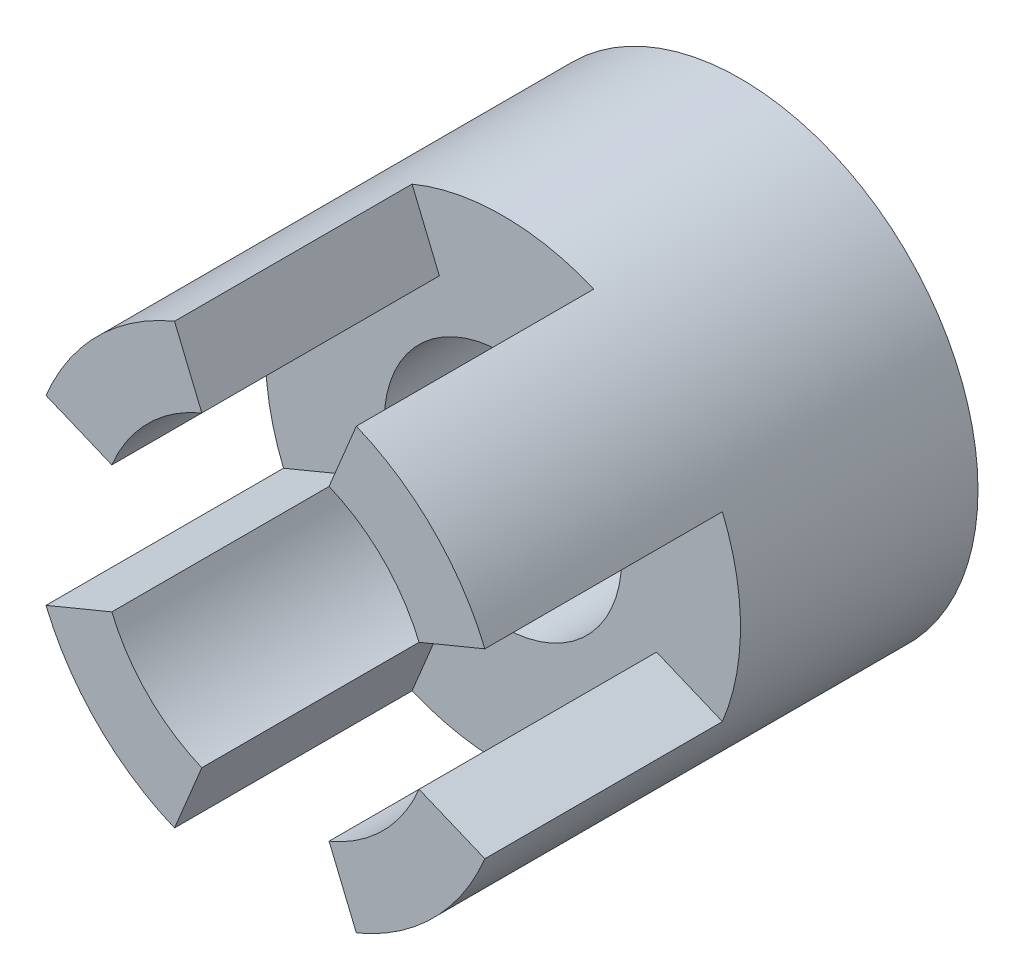
ISO-10303-21;
HEADER;
FILE_DESCRIPTION(('STEP AP214'),'2;1');
FILE_NAME('part.step','',(''),(''),'','','');
FILE_SCHEMA(('AUTOMOTIVE_DESIGN { 1 0 10303 214 1 1 1 1 }'));
ENDSEC;
DATA;
#1=APPLICATION_CONTEXT('core data for automotive mechanical design processes');
#2=APPLICATION_PROTOCOL_DEFINITION('international standard','automotive_design',2000,#1);
#3=PRODUCT_CONTEXT('',#1,'mechanical');
#4=PRODUCT('Part','Part','',(#3));
#5=PRODUCT_RELATED_PRODUCT_CATEGORY('part','',(#4));
#6=PRODUCT_DEFINITION_FORMATION('','',#4);
#7=PRODUCT_DEFINITION_CONTEXT('part definition',#1,'design');
#8=PRODUCT_DEFINITION('design','',#6,#7);
#9=PRODUCT_DEFINITION_SHAPE('','',#8);
#10=(LENGTH_UNIT() NAMED_UNIT(*) SI_UNIT(.MILLI.,.METRE.));
#11=(NAMED_UNIT(*) PLANE_ANGLE_UNIT() SI_UNIT($,.RADIAN.));
#12=(NAMED_UNIT(*) SI_UNIT($,.STERADIAN.) SOLID_ANGLE_UNIT());
#13=UNCERTAINTY_MEASURE_WITH_UNIT(LENGTH_MEASURE(1.E-05),#10,'distance_accuracy_value','');
#14=(GEOMETRIC_REPRESENTATION_CONTEXT(3) GLOBAL_UNCERTAINTY_ASSIGNED_CONTEXT((#13)) GLOBAL_UNIT_ASSIGNED_CONTEXT((#10,
#11,#12)) REPRESENTATION_CONTEXT('',''));
#15=CARTESIAN_POINT('',(0.,0.,0.));
#16=DIRECTION('',(0.,0.,1.));
#17=DIRECTION('',(1.,0.,0.));
#18=AXIS2_PLACEMENT_3D('',#15,#16,#17);
#19=CARTESIAN_POINT('',(0.,0.,20.));
#20=DIRECTION('',(0.,0.,1.));
#21=DIRECTION('',(1.,0.,0.));
#22=AXIS2_PLACEMENT_3D('',#19,#20,#21);
#23=PLANE('',#22);
#24=CARTESIAN_POINT('',(0.,0.,20.));
#25=DIRECTION('',(0.,0.,1.));
#26=DIRECTION('',(1.,0.,0.));
#27=AXIS2_PLACEMENT_3D('',#24,#25,#26);
#28=CIRCLE('',#27,7.);
#29=CARTESIAN_POINT('',(6.46715672757901,2.67878402655563,20.));
#30=VERTEX_POINT('',#29);
#31=CARTESIAN_POINT('',(2.67878402655563,6.46715672757901,20.));
#32=VERTEX_POINT('',#31);
#33=EDGE_CURVE('E142',#30,#32,#28,.T.);
#34=ORIENTED_EDGE('',*,*,#33,.F.);
#35=DIRECTION('',(-0.923879532511287,-0.38268343236509,0.));
#36=VECTOR('',#35,1.);
#37=CARTESIAN_POINT('',(0.,0.,20.));
#38=LINE('',#37,#36);
#39=CARTESIAN_POINT('',(9.23879532511287,3.82683432365091,20.));
#40=VERTEX_POINT('',#39);
#41=EDGE_CURVE('E173',#40,#30,#38,.T.);
#42=ORIENTED_EDGE('',*,*,#41,.F.);
#43=CARTESIAN_POINT('',(0.,0.,20.));
#44=DIRECTION('',(0.,0.,1.));
#45=DIRECTION('',(1.,0.,0.));
#46=AXIS2_PLACEMENT_3D('',#43,#44,#45);
#47=CIRCLE('',#46,10.);
#48=CARTESIAN_POINT('',(3.82683432365091,9.23879532511287,20.));
#49=VERTEX_POINT('',#48);
#50=EDGE_CURVE('E234',#40,#49,#47,.T.);
#51=ORIENTED_EDGE('',*,*,#50,.T.);
#52=DIRECTION('',(-0.382683432365091,-0.923879532511287,0.));
#53=VECTOR('',#52,1.);
#54=CARTESIAN_POINT('',(0.,0.,20.));
#55=LINE('',#54,#53);
#56=EDGE_CURVE('E154',#49,#32,#55,.T.);
#57=ORIENTED_EDGE('',*,*,#56,.T.);
#58=EDGE_LOOP('',(#34,#42,#51,#57));
#59=FACE_BOUND('',#58,.T.);
#60=ADVANCED_FACE('F37',(#59),#23,.T.);
#61=CARTESIAN_POINT('',(-2.67878402655563,6.46715672757901,20.));
#62=VERTEX_POINT('',#61);
#63=CARTESIAN_POINT('',(-6.46715672757901,2.67878402655563,20.));
#64=VERTEX_POINT('',#63);
#65=EDGE_CURVE('E318',#62,#64,#28,.T.);
#66=ORIENTED_EDGE('',*,*,#65,.F.);
#67=DIRECTION('',(0.38268343236509,-0.923879532511287,0.));
#68=VECTOR('',#67,1.);
#69=CARTESIAN_POINT('',(0.,0.,20.));
#70=LINE('',#69,#68);
#71=CARTESIAN_POINT('',(-3.8268343236509,9.23879532511287,20.));
#72=VERTEX_POINT('',#71);
#73=EDGE_CURVE('E150',#72,#62,#70,.T.);
#74=ORIENTED_EDGE('',*,*,#73,.F.);
#75=CARTESIAN_POINT('',(-9.23879532511287,3.8268343236509,20.));
#76=VERTEX_POINT('',#75);
#77=EDGE_CURVE('E236',#72,#76,#47,.T.);
#78=ORIENTED_EDGE('',*,*,#77,.T.);
#79=DIRECTION('',(0.923879532511287,-0.38268343236509,0.));
#80=VECTOR('',#79,1.);
#81=CARTESIAN_POINT('',(0.,0.,20.));
#82=LINE('',#81,#80);
#83=EDGE_CURVE('E102',#76,#64,#82,.T.);
#84=ORIENTED_EDGE('',*,*,#83,.T.);
#85=EDGE_LOOP('',(#66,#74,#78,#84));
#86=FACE_BOUND('',#85,.T.);
#87=ADVANCED_FACE('F258',(#86),#23,.T.);
#88=CARTESIAN_POINT('',(-6.46715672757901,-2.67878402655563,20.));
#89=VERTEX_POINT('',#88);
#90=CARTESIAN_POINT('',(-2.67878402655563,-6.46715672757901,20.));
#91=VERTEX_POINT('',#90);
#92=EDGE_CURVE('E352',#89,#91,#28,.T.);
#93=ORIENTED_EDGE('',*,*,#92,.F.);
#94=DIRECTION('',(0.923879532511287,0.38268343236509,0.));
#95=VECTOR('',#94,1.);
#96=CARTESIAN_POINT('',(0.,0.,20.));
#97=LINE('',#96,#95);
#98=CARTESIAN_POINT('',(-9.23879532511287,-3.8268343236509,20.));
#99=VERTEX_POINT('',#98);
#100=EDGE_CURVE('E218',#99,#89,#97,.T.);
#101=ORIENTED_EDGE('',*,*,#100,.F.);
#102=CARTESIAN_POINT('',(-3.82683432365091,-9.23879532511287,20.));
#103=VERTEX_POINT('',#102);
#104=EDGE_CURVE('E330',#99,#103,#47,.T.);
#105=ORIENTED_EDGE('',*,*,#104,.T.);
#106=DIRECTION('',(0.382683432365091,0.923879532511287,0.));
#107=VECTOR('',#106,1.);
#108=CARTESIAN_POINT('',(0.,0.,20.));
#109=LINE('',#108,#107);
#110=EDGE_CURVE('E200',#103,#91,#109,.T.);
#111=ORIENTED_EDGE('',*,*,#110,.T.);
#112=EDGE_LOOP('',(#93,#101,#105,#111));
#113=FACE_BOUND('',#112,.T.);
#114=ADVANCED_FACE('F254',(#113),#23,.T.);
#115=CARTESIAN_POINT('',(0.,0.,0.));
#116=DIRECTION('',(0.,0.,1.));
#117=DIRECTION('',(1.,0.,0.));
#118=AXIS2_PLACEMENT_3D('',#115,#116,#117);
#119=PLANE('',#118);
#120=CARTESIAN_POINT('',(0.,0.,0.));
#121=DIRECTION('',(0.,0.,1.));
#122=DIRECTION('',(1.,0.,0.));
#123=AXIS2_PLACEMENT_3D('',#120,#121,#122);
#124=CIRCLE('',#123,10.);
#125=CARTESIAN_POINT('',(10.,0.,0.));
#126=VERTEX_POINT('',#125);
#127=EDGE_CURVE('E11',#126,#126,#124,.T.);
#128=ORIENTED_EDGE('',*,*,#127,.F.);
#129=EDGE_LOOP('',(#128));
#130=FACE_BOUND('',#129,.T.);
#131=CARTESIAN_POINT('',(0.,0.,0.));
#132=DIRECTION('',(0.,0.,1.));
#133=DIRECTION('',(1.,0.,0.));
#134=AXIS2_PLACEMENT_3D('',#131,#132,#133);
#135=CIRCLE('',#134,5.);
#136=CARTESIAN_POINT('',(5.,0.,0.));
#137=VERTEX_POINT('',#136);
#138=EDGE_CURVE('E46',#137,#137,#135,.T.);
#139=ORIENTED_EDGE('',*,*,#138,.T.);
#140=EDGE_LOOP('',(#139));
#141=FACE_BOUND('',#140,.T.);
#142=ADVANCED_FACE('F240',(#130,#141),#119,.F.);
#143=CARTESIAN_POINT('',(0.,0.,10.));
#144=DIRECTION('',(0.,0.,-1.));
#145=DIRECTION('',(-1.,0.,0.));
#146=AXIS2_PLACEMENT_3D('',#143,#144,#145);
#147=CYLINDRICAL_SURFACE('',#146,10.);
#148=ORIENTED_EDGE('',*,*,#127,.T.);
#149=EDGE_LOOP('',(#148));
#150=FACE_BOUND('',#149,.T.);
#151=ORIENTED_EDGE('',*,*,#77,.F.);
#152=DIRECTION('',(0.,0.,1.));
#153=VECTOR('',#152,1.);
#154=CARTESIAN_POINT('',(-3.8268343236509,9.23879532511287,10.));
#155=LINE('',#154,#153);
#156=CARTESIAN_POINT('',(-3.8268343236509,9.23879532511287,10.));
#157=VERTEX_POINT('',#156);
#158=EDGE_CURVE('E166',#157,#72,#155,.T.);
#159=ORIENTED_EDGE('',*,*,#158,.F.);
#160=CARTESIAN_POINT('',(0.,0.,10.));
#161=DIRECTION('',(0.,0.,1.));
#162=DIRECTION('',(1.,0.,0.));
#163=AXIS2_PLACEMENT_3D('',#160,#161,#162);
#164=CIRCLE('',#163,10.);
#165=CARTESIAN_POINT('',(3.82683432365091,9.23879532511287,10.));
#166=VERTEX_POINT('',#165);
#167=EDGE_CURVE('E54',#166,#157,#164,.T.);
#168=ORIENTED_EDGE('',*,*,#167,.F.);
#169=DIRECTION('',(0.,0.,1.));
#170=VECTOR('',#169,1.);
#171=CARTESIAN_POINT('',(3.82683432365091,9.23879532511287,10.));
#172=LINE('',#171,#170);
#173=EDGE_CURVE('E145',#166,#49,#172,.T.);
#174=ORIENTED_EDGE('',*,*,#173,.T.);
#175=ORIENTED_EDGE('',*,*,#50,.F.);
#176=DIRECTION('',(0.,0.,1.));
#177=VECTOR('',#176,1.);
#178=CARTESIAN_POINT('',(9.23879532511287,3.82683432365091,10.));
#179=LINE('',#178,#177);
#180=CARTESIAN_POINT('',(9.23879532511287,3.82683432365091,10.));
#181=VERTEX_POINT('',#180);
#182=EDGE_CURVE('E184',#181,#40,#179,.T.);
#183=ORIENTED_EDGE('',*,*,#182,.F.);
#184=CARTESIAN_POINT('',(0.,0.,10.));
#185=DIRECTION('',(0.,0.,1.));
#186=DIRECTION('',(1.,0.,0.));
#187=AXIS2_PLACEMENT_3D('',#184,#185,#186);
#188=CIRCLE('',#187,10.);
#189=CARTESIAN_POINT('',(9.23879532511287,-3.8268343236509,10.));
#190=VERTEX_POINT('',#189);
#191=EDGE_CURVE('E172',#190,#181,#188,.T.);
#192=ORIENTED_EDGE('',*,*,#191,.F.);
#193=DIRECTION('',(0.,0.,1.));
#194=VECTOR('',#193,1.);
#195=CARTESIAN_POINT('',(9.23879532511287,-3.8268343236509,10.));
#196=LINE('',#195,#194);
#197=CARTESIAN_POINT('',(9.23879532511287,-3.8268343236509,20.));
#198=VERTEX_POINT('',#197);
#199=EDGE_CURVE('E186',#190,#198,#196,.T.);
#200=ORIENTED_EDGE('',*,*,#199,.T.);
#201=CARTESIAN_POINT('',(3.8268343236509,-9.23879532511287,20.));
#202=VERTEX_POINT('',#201);
#203=EDGE_CURVE('E165',#202,#198,#47,.T.);
#204=ORIENTED_EDGE('',*,*,#203,.F.);
#205=DIRECTION('',(0.,0.,1.));
#206=VECTOR('',#205,1.);
#207=CARTESIAN_POINT('',(3.8268343236509,-9.23879532511287,10.));
#208=LINE('',#207,#206);
#209=CARTESIAN_POINT('',(3.8268343236509,-9.23879532511287,10.));
#210=VERTEX_POINT('',#209);
#211=EDGE_CURVE('E207',#210,#202,#208,.T.);
#212=ORIENTED_EDGE('',*,*,#211,.F.);
#213=CARTESIAN_POINT('',(0.,0.,10.));
#214=DIRECTION('',(0.,0.,1.));
#215=DIRECTION('',(1.,0.,0.));
#216=AXIS2_PLACEMENT_3D('',#213,#214,#215);
#217=CIRCLE('',#216,10.);
#218=CARTESIAN_POINT('',(-3.82683432365091,-9.23879532511287,10.));
#219=VERTEX_POINT('',#218);
#220=EDGE_CURVE('E193',#219,#210,#217,.T.);
#221=ORIENTED_EDGE('',*,*,#220,.F.);
#222=DIRECTION('',(0.,0.,1.));
#223=VECTOR('',#222,1.);
#224=CARTESIAN_POINT('',(-3.82683432365091,-9.23879532511287,10.));
#225=LINE('',#224,#223);
#226=EDGE_CURVE('E209',#219,#103,#225,.T.);
#227=ORIENTED_EDGE('',*,*,#226,.T.);
#228=ORIENTED_EDGE('',*,*,#104,.F.);
#229=DIRECTION('',(0.,0.,1.));
#230=VECTOR('',#229,1.);
#231=CARTESIAN_POINT('',(-9.23879532511287,-3.8268343236509,10.));
#232=LINE('',#231,#230);
#233=CARTESIAN_POINT('',(-9.23879532511287,-3.8268343236509,10.));
#234=VERTEX_POINT('',#233);
#235=EDGE_CURVE('E229',#234,#99,#232,.T.);
#236=ORIENTED_EDGE('',*,*,#235,.F.);
#237=CARTESIAN_POINT('',(0.,0.,10.));
#238=DIRECTION('',(0.,0.,1.));
#239=DIRECTION('',(1.,0.,0.));
#240=AXIS2_PLACEMENT_3D('',#237,#238,#239);
#241=CIRCLE('',#240,10.);
#242=CARTESIAN_POINT('',(-9.23879532511287,3.8268343236509,10.));
#243=VERTEX_POINT('',#242);
#244=EDGE_CURVE('E217',#243,#234,#241,.T.);
#245=ORIENTED_EDGE('',*,*,#244,.F.);
#246=DIRECTION('',(0.,0.,1.));
#247=VECTOR('',#246,1.);
#248=CARTESIAN_POINT('',(-9.23879532511287,3.8268343236509,10.));
#249=LINE('',#248,#247);
#250=EDGE_CURVE('E231',#243,#76,#249,.T.);
#251=ORIENTED_EDGE('',*,*,#250,.T.);
#252=EDGE_LOOP('',(#151,#159,#168,#174,#175,#183,#192,#200,#204,#212,#221,#227,#228,#236,#245,#251));
#253=FACE_BOUND('',#252,.T.);
#254=ADVANCED_FACE('F39',(#150,#253),#147,.T.);
#255=CARTESIAN_POINT('',(0.,0.,10.));
#256=DIRECTION('',(0.,0.,-1.));
#257=DIRECTION('',(-1.,0.,0.));
#258=AXIS2_PLACEMENT_3D('',#255,#256,#257);
#259=CYLINDRICAL_SURFACE('',#258,5.);
#260=CARTESIAN_POINT('',(0.,0.,10.));
#261=DIRECTION('',(0.,0.,1.));
#262=DIRECTION('',(1.,0.,0.));
#263=AXIS2_PLACEMENT_3D('',#260,#261,#262);
#264=CIRCLE('',#263,5.);
#265=CARTESIAN_POINT('',(5.,0.,10.));
#266=VERTEX_POINT('',#265);
#267=EDGE_CURVE('E132',#266,#266,#264,.T.);
#268=ORIENTED_EDGE('',*,*,#267,.T.);
#269=EDGE_LOOP('',(#268));
#270=FACE_BOUND('',#269,.T.);
#271=ORIENTED_EDGE('',*,*,#138,.F.);
#272=EDGE_LOOP('',(#271));
#273=FACE_BOUND('',#272,.T.);
#274=ADVANCED_FACE('F242',(#270,#273),#259,.F.);
#275=CARTESIAN_POINT('',(2.67878402655563,-6.46715672757901,20.));
#276=VERTEX_POINT('',#275);
#277=CARTESIAN_POINT('',(6.46715672757901,-2.67878402655563,20.));
#278=VERTEX_POINT('',#277);
#279=EDGE_CURVE('E112',#276,#278,#28,.T.);
#280=ORIENTED_EDGE('',*,*,#279,.F.);
#281=DIRECTION('',(-0.38268343236509,0.923879532511287,0.));
#282=VECTOR('',#281,1.);
#283=CARTESIAN_POINT('',(0.,0.,20.));
#284=LINE('',#283,#282);
#285=EDGE_CURVE('E194',#202,#276,#284,.T.);
#286=ORIENTED_EDGE('',*,*,#285,.F.);
#287=ORIENTED_EDGE('',*,*,#203,.T.);
#288=DIRECTION('',(-0.923879532511287,0.38268343236509,0.));
#289=VECTOR('',#288,1.);
#290=CARTESIAN_POINT('',(0.,0.,20.));
#291=LINE('',#290,#289);
#292=EDGE_CURVE('E177',#198,#278,#291,.T.);
#293=ORIENTED_EDGE('',*,*,#292,.T.);
#294=EDGE_LOOP('',(#280,#286,#287,#293));
#295=FACE_BOUND('',#294,.T.);
#296=ADVANCED_FACE('F244',(#295),#23,.T.);
#297=CARTESIAN_POINT('',(0.,0.,10.));
#298=DIRECTION('',(0.38268343236509,-0.923879532511287,0.));
#299=DIRECTION('',(0.923879532511287,0.38268343236509,0.));
#300=AXIS2_PLACEMENT_3D('',#297,#298,#299);
#301=PLANE('',#300);
#302=ORIENTED_EDGE('',*,*,#100,.T.);
#303=DIRECTION('',(0.,0.,1.));
#304=VECTOR('',#303,1.);
#305=CARTESIAN_POINT('',(-6.46715672757901,-2.67878402655563,10.));
#306=LINE('',#305,#304);
#307=CARTESIAN_POINT('',(-6.46715672757901,-2.67878402655563,10.));
#308=VERTEX_POINT('',#307);
#309=EDGE_CURVE('E203',#308,#89,#306,.T.);
#310=ORIENTED_EDGE('',*,*,#309,.F.);
#311=DIRECTION('',(0.923879532511287,0.38268343236509,0.));
#312=VECTOR('',#311,1.);
#313=CARTESIAN_POINT('',(0.,0.,10.));
#314=LINE('',#313,#312);
#315=EDGE_CURVE('E220',#234,#308,#314,.T.);
#316=ORIENTED_EDGE('',*,*,#315,.F.);
#317=ORIENTED_EDGE('',*,*,#235,.T.);
#318=EDGE_LOOP('',(#302,#310,#316,#317));
#319=FACE_BOUND('',#318,.T.);
#320=ADVANCED_FACE('F251',(#319),#301,.F.);
#321=CARTESIAN_POINT('',(0.,0.,10.));
#322=DIRECTION('',(-0.38268343236509,-0.923879532511287,0.));
#323=DIRECTION('',(0.923879532511287,-0.38268343236509,0.));
#324=AXIS2_PLACEMENT_3D('',#321,#322,#323);
#325=PLANE('',#324);
#326=ORIENTED_EDGE('',*,*,#83,.F.);
#327=ORIENTED_EDGE('',*,*,#250,.F.);
#328=DIRECTION('',(0.923879532511287,-0.38268343236509,0.));
#329=VECTOR('',#328,1.);
#330=CARTESIAN_POINT('',(0.,0.,10.));
#331=LINE('',#330,#329);
#332=CARTESIAN_POINT('',(-6.46715672757901,2.67878402655563,10.));
#333=VERTEX_POINT('',#332);
#334=EDGE_CURVE('E214',#243,#333,#331,.T.);
#335=ORIENTED_EDGE('',*,*,#334,.T.);
#336=DIRECTION('',(0.,0.,1.));
#337=VECTOR('',#336,1.);
#338=CARTESIAN_POINT('',(-6.46715672757901,2.67878402655563,10.));
#339=LINE('',#338,#337);
#340=EDGE_CURVE('E223',#333,#64,#339,.T.);
#341=ORIENTED_EDGE('',*,*,#340,.T.);
#342=EDGE_LOOP('',(#326,#327,#335,#341));
#343=FACE_BOUND('',#342,.T.);
#344=ADVANCED_FACE('F265',(#343),#325,.T.);
#345=CARTESIAN_POINT('',(0.,0.,10.));
#346=DIRECTION('',(0.923879532511287,0.38268343236509,0.));
#347=DIRECTION('',(-0.38268343236509,0.923879532511287,0.));
#348=AXIS2_PLACEMENT_3D('',#345,#346,#347);
#349=PLANE('',#348);
#350=ORIENTED_EDGE('',*,*,#285,.T.);
#351=DIRECTION('',(0.,0.,1.));
#352=VECTOR('',#351,1.);
#353=CARTESIAN_POINT('',(2.67878402655563,-6.46715672757901,10.));
#354=LINE('',#353,#352);
#355=CARTESIAN_POINT('',(2.67878402655563,-6.46715672757901,10.));
#356=VERTEX_POINT('',#355);
#357=EDGE_CURVE('E180',#356,#276,#354,.T.);
#358=ORIENTED_EDGE('',*,*,#357,.F.);
#359=DIRECTION('',(-0.38268343236509,0.923879532511287,0.));
#360=VECTOR('',#359,1.);
#361=CARTESIAN_POINT('',(0.,0.,10.));
#362=LINE('',#361,#360);
#363=EDGE_CURVE('E196',#210,#356,#362,.T.);
#364=ORIENTED_EDGE('',*,*,#363,.F.);
#365=ORIENTED_EDGE('',*,*,#211,.T.);
#366=EDGE_LOOP('',(#350,#358,#364,#365));
#367=FACE_BOUND('',#366,.T.);
#368=ADVANCED_FACE('F268',(#367),#349,.F.);
#369=CARTESIAN_POINT('',(0.,0.,10.));
#370=DIRECTION('',(0.923879532511287,-0.382683432365091,0.));
#371=DIRECTION('',(0.382683432365091,0.923879532511287,0.));
#372=AXIS2_PLACEMENT_3D('',#369,#370,#371);
#373=PLANE('',#372);
#374=ORIENTED_EDGE('',*,*,#110,.F.);
#375=ORIENTED_EDGE('',*,*,#226,.F.);
#376=DIRECTION('',(0.382683432365091,0.923879532511287,0.));
#377=VECTOR('',#376,1.);
#378=CARTESIAN_POINT('',(0.,0.,10.));
#379=LINE('',#378,#377);
#380=CARTESIAN_POINT('',(-2.67878402655563,-6.46715672757901,10.));
#381=VERTEX_POINT('',#380);
#382=EDGE_CURVE('E190',#219,#381,#379,.T.);
#383=ORIENTED_EDGE('',*,*,#382,.T.);
#384=DIRECTION('',(0.,0.,1.));
#385=VECTOR('',#384,1.);
#386=CARTESIAN_POINT('',(-2.67878402655563,-6.46715672757901,10.));
#387=LINE('',#386,#385);
#388=EDGE_CURVE('E199',#381,#91,#387,.T.);
#389=ORIENTED_EDGE('',*,*,#388,.T.);
#390=EDGE_LOOP('',(#374,#375,#383,#389));
#391=FACE_BOUND('',#390,.T.);
#392=ADVANCED_FACE('F272',(#391),#373,.T.);
#393=CARTESIAN_POINT('',(0.,0.,10.));
#394=DIRECTION('',(-0.38268343236509,0.923879532511287,0.));
#395=DIRECTION('',(-0.923879532511287,-0.38268343236509,0.));
#396=AXIS2_PLACEMENT_3D('',#393,#394,#395);
#397=PLANE('',#396);
#398=ORIENTED_EDGE('',*,*,#41,.T.);
#399=DIRECTION('',(0.,0.,1.));
#400=VECTOR('',#399,1.);
#401=CARTESIAN_POINT('',(6.46715672757901,2.67878402655563,10.));
#402=LINE('',#401,#400);
#403=CARTESIAN_POINT('',(6.46715672757901,2.67878402655563,10.));
#404=VERTEX_POINT('',#403);
#405=EDGE_CURVE('E160',#404,#30,#402,.T.);
#406=ORIENTED_EDGE('',*,*,#405,.F.);
#407=DIRECTION('',(-0.923879532511287,-0.38268343236509,0.));
#408=VECTOR('',#407,1.);
#409=CARTESIAN_POINT('',(0.,0.,10.));
#410=LINE('',#409,#408);
#411=EDGE_CURVE('E128',#181,#404,#410,.T.);
#412=ORIENTED_EDGE('',*,*,#411,.F.);
#413=ORIENTED_EDGE('',*,*,#182,.T.);
#414=EDGE_LOOP('',(#398,#406,#412,#413));
#415=FACE_BOUND('',#414,.T.);
#416=ADVANCED_FACE('F275',(#415),#397,.F.);
#417=CARTESIAN_POINT('',(0.,0.,10.));
#418=DIRECTION('',(0.38268343236509,0.923879532511287,0.));
#419=DIRECTION('',(-0.923879532511287,0.38268343236509,0.));
#420=AXIS2_PLACEMENT_3D('',#417,#418,#419);
#421=PLANE('',#420);
#422=ORIENTED_EDGE('',*,*,#292,.F.);
#423=ORIENTED_EDGE('',*,*,#199,.F.);
#424=DIRECTION('',(-0.923879532511287,0.38268343236509,0.));
#425=VECTOR('',#424,1.);
#426=CARTESIAN_POINT('',(0.,0.,10.));
#427=LINE('',#426,#425);
#428=CARTESIAN_POINT('',(6.46715672757901,-2.67878402655563,10.));
#429=VERTEX_POINT('',#428);
#430=EDGE_CURVE('E169',#190,#429,#427,.T.);
#431=ORIENTED_EDGE('',*,*,#430,.T.);
#432=DIRECTION('',(0.,0.,1.));
#433=VECTOR('',#432,1.);
#434=CARTESIAN_POINT('',(6.46715672757901,-2.67878402655563,10.));
#435=LINE('',#434,#433);
#436=EDGE_CURVE('E176',#429,#278,#435,.T.);
#437=ORIENTED_EDGE('',*,*,#436,.T.);
#438=EDGE_LOOP('',(#422,#423,#431,#437));
#439=FACE_BOUND('',#438,.T.);
#440=ADVANCED_FACE('F280',(#439),#421,.T.);
#441=CARTESIAN_POINT('',(0.,0.,10.));
#442=DIRECTION('',(-0.923879532511287,-0.38268343236509,0.));
#443=DIRECTION('',(0.38268343236509,-0.923879532511287,0.));
#444=AXIS2_PLACEMENT_3D('',#441,#442,#443);
#445=PLANE('',#444);
#446=ORIENTED_EDGE('',*,*,#73,.T.);
#447=DIRECTION('',(0.,0.,1.));
#448=VECTOR('',#447,1.);
#449=CARTESIAN_POINT('',(-2.67878402655563,6.46715672757901,10.));
#450=LINE('',#449,#448);
#451=CARTESIAN_POINT('',(-2.67878402655563,6.46715672757901,10.));
#452=VERTEX_POINT('',#451);
#453=EDGE_CURVE('E162',#452,#62,#450,.T.);
#454=ORIENTED_EDGE('',*,*,#453,.F.);
#455=DIRECTION('',(0.38268343236509,-0.923879532511287,0.));
#456=VECTOR('',#455,1.);
#457=CARTESIAN_POINT('',(0.,0.,10.));
#458=LINE('',#457,#456);
#459=EDGE_CURVE('E146',#157,#452,#458,.T.);
#460=ORIENTED_EDGE('',*,*,#459,.F.);
#461=ORIENTED_EDGE('',*,*,#158,.T.);
#462=EDGE_LOOP('',(#446,#454,#460,#461));
#463=FACE_BOUND('',#462,.T.);
#464=ADVANCED_FACE('F283',(#463),#445,.F.);
#465=CARTESIAN_POINT('',(0.,0.,10.));
#466=DIRECTION('',(-0.923879532511287,0.382683432365091,0.));
#467=DIRECTION('',(-0.382683432365091,-0.923879532511287,0.));
#468=AXIS2_PLACEMENT_3D('',#465,#466,#467);
#469=PLANE('',#468);
#470=ORIENTED_EDGE('',*,*,#56,.F.);
#471=ORIENTED_EDGE('',*,*,#173,.F.);
#472=DIRECTION('',(-0.382683432365091,-0.923879532511287,0.));
#473=VECTOR('',#472,1.);
#474=CARTESIAN_POINT('',(0.,0.,10.));
#475=LINE('',#474,#473);
#476=CARTESIAN_POINT('',(2.67878402655563,6.46715672757901,10.));
#477=VERTEX_POINT('',#476);
#478=EDGE_CURVE('E125',#166,#477,#475,.T.);
#479=ORIENTED_EDGE('',*,*,#478,.T.);
#480=DIRECTION('',(0.,0.,1.));
#481=VECTOR('',#480,1.);
#482=CARTESIAN_POINT('',(2.67878402655563,6.46715672757901,10.));
#483=LINE('',#482,#481);
#484=EDGE_CURVE('E138',#477,#32,#483,.T.);
#485=ORIENTED_EDGE('',*,*,#484,.T.);
#486=EDGE_LOOP('',(#470,#471,#479,#485));
#487=FACE_BOUND('',#486,.T.);
#488=ADVANCED_FACE('F148',(#487),#469,.T.);
#489=CARTESIAN_POINT('',(0.,0.,10.));
#490=DIRECTION('',(0.,0.,1.));
#491=DIRECTION('',(1.,0.,0.));
#492=AXIS2_PLACEMENT_3D('',#489,#490,#491);
#493=PLANE('',#492);
#494=ORIENTED_EDGE('',*,*,#459,.T.);
#495=CARTESIAN_POINT('',(0.,0.,10.));
#496=DIRECTION('',(0.,0.,1.));
#497=DIRECTION('',(1.,0.,0.));
#498=AXIS2_PLACEMENT_3D('',#495,#496,#497);
#499=CIRCLE('',#498,7.);
#500=EDGE_CURVE('E133',#452,#333,#499,.T.);
#501=ORIENTED_EDGE('',*,*,#500,.T.);
#502=ORIENTED_EDGE('',*,*,#334,.F.);
#503=ORIENTED_EDGE('',*,*,#244,.T.);
#504=ORIENTED_EDGE('',*,*,#315,.T.);
#505=EDGE_CURVE('E323',#308,#381,#499,.T.);
#506=ORIENTED_EDGE('',*,*,#505,.T.);
#507=ORIENTED_EDGE('',*,*,#382,.F.);
#508=ORIENTED_EDGE('',*,*,#220,.T.);
#509=ORIENTED_EDGE('',*,*,#363,.T.);
#510=EDGE_CURVE('E135',#356,#429,#499,.T.);
#511=ORIENTED_EDGE('',*,*,#510,.T.);
#512=ORIENTED_EDGE('',*,*,#430,.F.);
#513=ORIENTED_EDGE('',*,*,#191,.T.);
#514=ORIENTED_EDGE('',*,*,#411,.T.);
#515=EDGE_CURVE('E120',#404,#477,#499,.T.);
#516=ORIENTED_EDGE('',*,*,#515,.T.);
#517=ORIENTED_EDGE('',*,*,#478,.F.);
#518=ORIENTED_EDGE('',*,*,#167,.T.);
#519=EDGE_LOOP('',(#494,#501,#502,#503,#504,#506,#507,#508,#509,#511,#512,#513,#514,#516,#517,#518));
#520=FACE_BOUND('',#519,.T.);
#521=ORIENTED_EDGE('',*,*,#267,.F.);
#522=EDGE_LOOP('',(#521));
#523=FACE_BOUND('',#522,.T.);
#524=ADVANCED_FACE('F122',(#520,#523),#493,.T.);
#525=CARTESIAN_POINT('',(0.,0.,10.));
#526=DIRECTION('',(0.,0.,1.));
#527=DIRECTION('',(1.,0.,0.));
#528=AXIS2_PLACEMENT_3D('',#525,#526,#527);
#529=CYLINDRICAL_SURFACE('',#528,7.);
#530=ORIENTED_EDGE('',*,*,#92,.T.);
#531=ORIENTED_EDGE('',*,*,#388,.F.);
#532=ORIENTED_EDGE('',*,*,#505,.F.);
#533=ORIENTED_EDGE('',*,*,#309,.T.);
#534=EDGE_LOOP('',(#530,#531,#532,#533));
#535=FACE_BOUND('',#534,.T.);
#536=ADVANCED_FACE('F295',(#535),#529,.F.);
#537=ORIENTED_EDGE('',*,*,#279,.T.);
#538=ORIENTED_EDGE('',*,*,#436,.F.);
#539=ORIENTED_EDGE('',*,*,#510,.F.);
#540=ORIENTED_EDGE('',*,*,#357,.T.);
#541=EDGE_LOOP('',(#537,#538,#539,#540));
#542=FACE_BOUND('',#541,.T.);
#543=ADVANCED_FACE('F297',(#542),#529,.F.);
#544=ORIENTED_EDGE('',*,*,#33,.T.);
#545=ORIENTED_EDGE('',*,*,#484,.F.);
#546=ORIENTED_EDGE('',*,*,#515,.F.);
#547=ORIENTED_EDGE('',*,*,#405,.T.);
#548=EDGE_LOOP('',(#544,#545,#546,#547));
#549=FACE_BOUND('',#548,.T.);
#550=ADVANCED_FACE('F139',(#549),#529,.F.);
#551=ORIENTED_EDGE('',*,*,#340,.F.);
#552=ORIENTED_EDGE('',*,*,#500,.F.);
#553=ORIENTED_EDGE('',*,*,#453,.T.);
#554=ORIENTED_EDGE('',*,*,#65,.T.);
#555=EDGE_LOOP('',(#551,#552,#553,#554));
#556=FACE_BOUND('',#555,.T.);
#557=ADVANCED_FACE('F299',(#556),#529,.F.);
#558=CLOSED_SHELL('',(#60,#87,#114,#142,#254,#274,#296,#320,#344,#368,#392,#416,#440,#464,#488,
#524,#536,#543,#550,#557));
#559=MANIFOLD_SOLID_BREP('B2',#558);
#560=ADVANCED_BREP_SHAPE_REPRESENTATION('',(#18,#559),#14);
#561=SHAPE_DEFINITION_REPRESENTATION(#9,#560);
ENDSEC;
END-ISO-10303-21;
